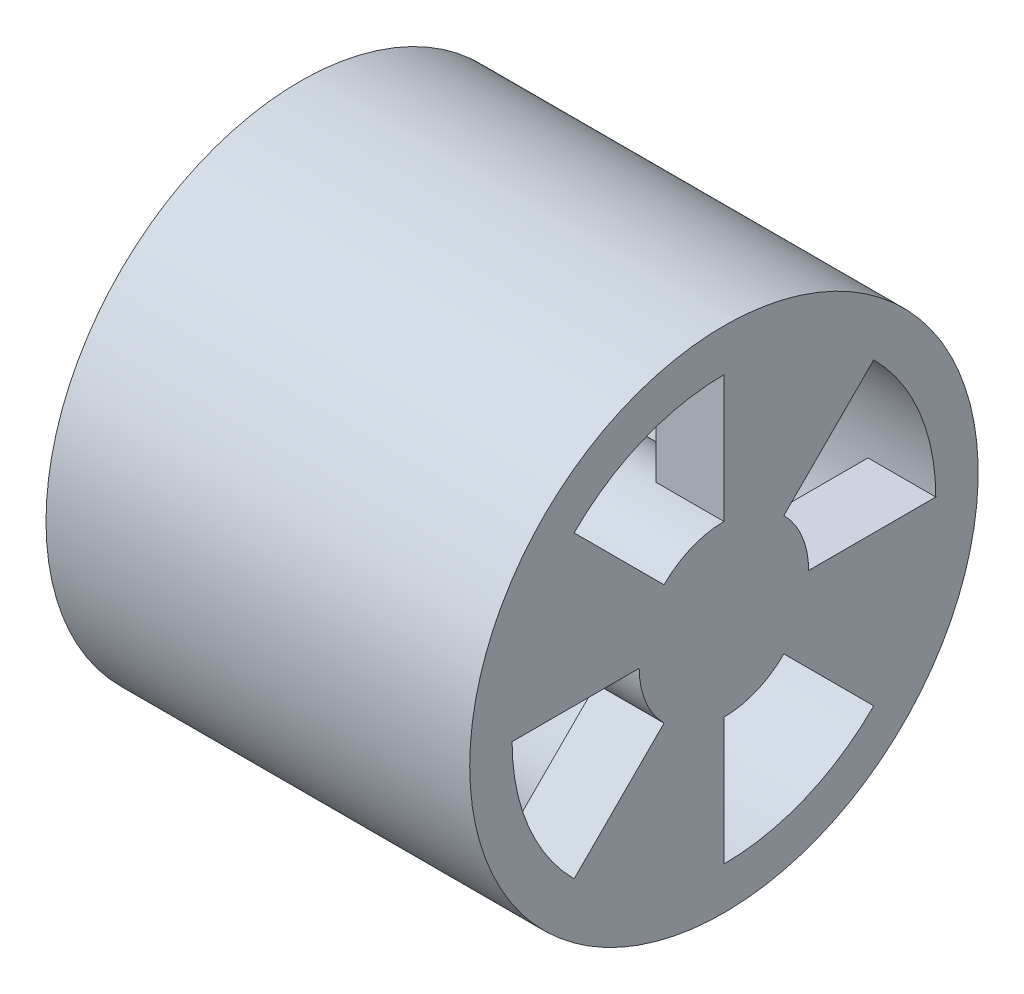
ISO-10303-21;
HEADER;
FILE_DESCRIPTION(('STEP AP214'),'2;1');
FILE_NAME('part.step','',(''),(''),'','','');
FILE_SCHEMA(('AUTOMOTIVE_DESIGN { 1 0 10303 214 1 1 1 1 }'));
ENDSEC;
DATA;
#1=APPLICATION_CONTEXT('core data for automotive mechanical design processes');
#2=APPLICATION_PROTOCOL_DEFINITION('international standard','automotive_design',2000,#1);
#3=PRODUCT_CONTEXT('',#1,'mechanical');
#4=PRODUCT('Part','Part','',(#3));
#5=PRODUCT_RELATED_PRODUCT_CATEGORY('part','',(#4));
#6=PRODUCT_DEFINITION_FORMATION('','',#4);
#7=PRODUCT_DEFINITION_CONTEXT('part definition',#1,'design');
#8=PRODUCT_DEFINITION('design','',#6,#7);
#9=PRODUCT_DEFINITION_SHAPE('','',#8);
#10=(LENGTH_UNIT() NAMED_UNIT(*) SI_UNIT(.MILLI.,.METRE.));
#11=(NAMED_UNIT(*) PLANE_ANGLE_UNIT() SI_UNIT($,.RADIAN.));
#12=(NAMED_UNIT(*) SI_UNIT($,.STERADIAN.) SOLID_ANGLE_UNIT());
#13=UNCERTAINTY_MEASURE_WITH_UNIT(LENGTH_MEASURE(1.E-05),#10,'distance_accuracy_value','');
#14=(GEOMETRIC_REPRESENTATION_CONTEXT(3) GLOBAL_UNCERTAINTY_ASSIGNED_CONTEXT((#13)) GLOBAL_UNIT_ASSIGNED_CONTEXT((#10,
#11,#12)) REPRESENTATION_CONTEXT('',''));
#15=CARTESIAN_POINT('',(0.,0.,0.));
#16=DIRECTION('',(0.,0.,1.));
#17=DIRECTION('',(1.,0.,0.));
#18=AXIS2_PLACEMENT_3D('',#15,#16,#17);
#19=CARTESIAN_POINT('',(21.,0.,0.));
#20=DIRECTION('',(-1.,0.,0.));
#21=DIRECTION('',(0.,0.,1.));
#22=AXIS2_PLACEMENT_3D('',#19,#20,#21);
#23=PLANE('',#22);
#24=DIRECTION('',(0.,0.707106781186552,0.707106781186544));
#25=VECTOR('',#24,1.);
#26=CARTESIAN_POINT('',(21.,0.,0.));
#27=LINE('',#26,#25);
#28=CARTESIAN_POINT('',(21.,3.53553390593276,3.53553390593272));
#29=VERTEX_POINT('',#28);
#30=CARTESIAN_POINT('',(21.,8.83883476483189,8.83883476483179));
#31=VERTEX_POINT('',#30);
#32=EDGE_CURVE('E231',#29,#31,#27,.T.);
#33=ORIENTED_EDGE('',*,*,#32,.F.);
#34=CARTESIAN_POINT('',(21.,0.,0.));
#35=DIRECTION('',(-1.,0.,0.));
#36=DIRECTION('',(0.,0.,1.));
#37=AXIS2_PLACEMENT_3D('',#34,#35,#36);
#38=CIRCLE('',#37,5.);
#39=CARTESIAN_POINT('',(21.,0.,5.));
#40=VERTEX_POINT('',#39);
#41=EDGE_CURVE('E317',#40,#29,#38,.T.);
#42=ORIENTED_EDGE('',*,*,#41,.F.);
#43=DIRECTION('',(0.,0.,1.));
#44=VECTOR('',#43,1.);
#45=CARTESIAN_POINT('',(21.,0.,0.));
#46=LINE('',#45,#44);
#47=CARTESIAN_POINT('',(21.,0.,12.5));
#48=VERTEX_POINT('',#47);
#49=EDGE_CURVE('E256',#40,#48,#46,.T.);
#50=ORIENTED_EDGE('',*,*,#49,.T.);
#51=CARTESIAN_POINT('',(21.,0.,0.));
#52=DIRECTION('',(-1.,0.,0.));
#53=DIRECTION('',(0.,0.,1.));
#54=AXIS2_PLACEMENT_3D('',#51,#52,#53);
#55=CIRCLE('',#54,12.5);
#56=EDGE_CURVE('E327',#48,#31,#55,.T.);
#57=ORIENTED_EDGE('',*,*,#56,.T.);
#58=EDGE_LOOP('',(#33,#42,#50,#57));
#59=FACE_BOUND('',#58,.T.);
#60=ADVANCED_FACE('F39',(#59),#23,.T.);
#61=DIRECTION('',(0.,-1.,0.));
#62=VECTOR('',#61,1.);
#63=CARTESIAN_POINT('',(21.,0.,0.));
#64=LINE('',#63,#62);
#65=CARTESIAN_POINT('',(21.,12.5,0.));
#66=VERTEX_POINT('',#65);
#67=CARTESIAN_POINT('',(21.,5.,0.));
#68=VERTEX_POINT('',#67);
#69=EDGE_CURVE('E218',#66,#68,#64,.T.);
#70=ORIENTED_EDGE('',*,*,#69,.F.);
#71=CARTESIAN_POINT('',(21.,8.83883476483183,-8.83883476483186));
#72=VERTEX_POINT('',#71);
#73=EDGE_CURVE('E332',#66,#72,#55,.T.);
#74=ORIENTED_EDGE('',*,*,#73,.T.);
#75=DIRECTION('',(0.,-0.707106781186546,0.707106781186549));
#76=VECTOR('',#75,1.);
#77=CARTESIAN_POINT('',(21.,0.,0.));
#78=LINE('',#77,#76);
#79=CARTESIAN_POINT('',(21.,3.53553390593273,-3.53553390593275));
#80=VERTEX_POINT('',#79);
#81=EDGE_CURVE('E242',#72,#80,#78,.T.);
#82=ORIENTED_EDGE('',*,*,#81,.T.);
#83=EDGE_CURVE('E322',#68,#80,#38,.T.);
#84=ORIENTED_EDGE('',*,*,#83,.F.);
#85=EDGE_LOOP('',(#70,#74,#82,#84));
#86=FACE_BOUND('',#85,.T.);
#87=ADVANCED_FACE('F382',(#86),#23,.T.);
#88=CARTESIAN_POINT('',(21.,0.,-12.5));
#89=VERTEX_POINT('',#88);
#90=CARTESIAN_POINT('',(21.,-8.83883476483189,-8.83883476483179));
#91=VERTEX_POINT('',#90);
#92=EDGE_CURVE('E461',#89,#91,#55,.T.);
#93=ORIENTED_EDGE('',*,*,#92,.T.);
#94=DIRECTION('',(0.,0.707106781186552,0.707106781186544));
#95=VECTOR('',#94,1.);
#96=CARTESIAN_POINT('',(21.,0.,0.));
#97=LINE('',#96,#95);
#98=CARTESIAN_POINT('',(21.,-3.53553390593276,-3.53553390593272));
#99=VERTEX_POINT('',#98);
#100=EDGE_CURVE('E173',#91,#99,#97,.T.);
#101=ORIENTED_EDGE('',*,*,#100,.T.);
#102=CARTESIAN_POINT('',(21.,0.,-5.));
#103=VERTEX_POINT('',#102);
#104=EDGE_CURVE('E441',#103,#99,#38,.T.);
#105=ORIENTED_EDGE('',*,*,#104,.F.);
#106=DIRECTION('',(0.,0.,1.));
#107=VECTOR('',#106,1.);
#108=CARTESIAN_POINT('',(21.,0.,0.));
#109=LINE('',#108,#107);
#110=EDGE_CURVE('E288',#89,#103,#109,.T.);
#111=ORIENTED_EDGE('',*,*,#110,.F.);
#112=EDGE_LOOP('',(#93,#101,#105,#111));
#113=FACE_BOUND('',#112,.T.);
#114=ADVANCED_FACE('F377',(#113),#23,.T.);
#115=DIRECTION('',(0.,-0.707106781186546,0.707106781186549));
#116=VECTOR('',#115,1.);
#117=CARTESIAN_POINT('',(21.,0.,0.));
#118=LINE('',#117,#116);
#119=CARTESIAN_POINT('',(21.,-3.53553390593273,3.53553390593275));
#120=VERTEX_POINT('',#119);
#121=CARTESIAN_POINT('',(21.,-8.83883476483183,8.83883476483186));
#122=VERTEX_POINT('',#121);
#123=EDGE_CURVE('E207',#120,#122,#118,.T.);
#124=ORIENTED_EDGE('',*,*,#123,.F.);
#125=CARTESIAN_POINT('',(21.,-5.,0.));
#126=VERTEX_POINT('',#125);
#127=EDGE_CURVE('E323',#126,#120,#38,.T.);
#128=ORIENTED_EDGE('',*,*,#127,.F.);
#129=DIRECTION('',(0.,-1.,0.));
#130=VECTOR('',#129,1.);
#131=CARTESIAN_POINT('',(21.,0.,0.));
#132=LINE('',#131,#130);
#133=CARTESIAN_POINT('',(21.,-12.5,0.));
#134=VERTEX_POINT('',#133);
#135=EDGE_CURVE('E193',#126,#134,#132,.T.);
#136=ORIENTED_EDGE('',*,*,#135,.T.);
#137=EDGE_CURVE('E321',#134,#122,#55,.T.);
#138=ORIENTED_EDGE('',*,*,#137,.T.);
#139=EDGE_LOOP('',(#124,#128,#136,#138));
#140=FACE_BOUND('',#139,.T.);
#141=ADVANCED_FACE('F369',(#140),#23,.T.);
#142=CARTESIAN_POINT('',(25.,15.,0.));
#143=DIRECTION('',(-1.,0.,0.));
#144=DIRECTION('',(0.,0.,1.));
#145=AXIS2_PLACEMENT_3D('',#142,#143,#144);
#146=PLANE('',#145);
#147=DIRECTION('',(0.,-1.,0.));
#148=VECTOR('',#147,1.);
#149=CARTESIAN_POINT('',(25.,0.,0.));
#150=LINE('',#149,#148);
#151=CARTESIAN_POINT('',(25.,12.5,0.));
#152=VERTEX_POINT('',#151);
#153=CARTESIAN_POINT('',(25.,5.,0.));
#154=VERTEX_POINT('',#153);
#155=EDGE_CURVE('E226',#152,#154,#150,.T.);
#156=ORIENTED_EDGE('',*,*,#155,.T.);
#157=CARTESIAN_POINT('',(25.,0.,0.));
#158=DIRECTION('',(-1.,0.,0.));
#159=DIRECTION('',(0.,0.,1.));
#160=AXIS2_PLACEMENT_3D('',#157,#158,#159);
#161=CIRCLE('',#160,5.);
#162=CARTESIAN_POINT('',(25.,3.53553390593276,3.53553390593272));
#163=VERTEX_POINT('',#162);
#164=EDGE_CURVE('E213',#154,#163,#161,.F.);
#165=ORIENTED_EDGE('',*,*,#164,.T.);
#166=DIRECTION('',(0.,0.707106781186552,0.707106781186544));
#167=VECTOR('',#166,1.);
#168=CARTESIAN_POINT('',(25.,0.,0.));
#169=LINE('',#168,#167);
#170=CARTESIAN_POINT('',(25.,8.83883476483189,8.83883476483179));
#171=VERTEX_POINT('',#170);
#172=EDGE_CURVE('E217',#163,#171,#169,.T.);
#173=ORIENTED_EDGE('',*,*,#172,.T.);
#174=CARTESIAN_POINT('',(25.,0.,0.));
#175=DIRECTION('',(-1.,0.,0.));
#176=DIRECTION('',(0.,0.,1.));
#177=AXIS2_PLACEMENT_3D('',#174,#175,#176);
#178=CIRCLE('',#177,12.5);
#179=EDGE_CURVE('E222',#171,#152,#178,.T.);
#180=ORIENTED_EDGE('',*,*,#179,.T.);
#181=EDGE_LOOP('',(#156,#165,#173,#180));
#182=FACE_BOUND('',#181,.T.);
#183=DIRECTION('',(0.,0.,1.));
#184=VECTOR('',#183,1.);
#185=CARTESIAN_POINT('',(25.,0.,0.));
#186=LINE('',#185,#184);
#187=CARTESIAN_POINT('',(25.,0.,5.));
#188=VERTEX_POINT('',#187);
#189=CARTESIAN_POINT('',(25.,0.,12.5));
#190=VERTEX_POINT('',#189);
#191=EDGE_CURVE('E264',#188,#190,#186,.T.);
#192=ORIENTED_EDGE('',*,*,#191,.F.);
#193=CARTESIAN_POINT('',(25.,0.,0.));
#194=DIRECTION('',(-1.,0.,0.));
#195=DIRECTION('',(0.,0.,1.));
#196=AXIS2_PLACEMENT_3D('',#193,#194,#195);
#197=CIRCLE('',#196,5.);
#198=CARTESIAN_POINT('',(25.,-3.53553390593273,3.53553390593275));
#199=VERTEX_POINT('',#198);
#200=EDGE_CURVE('E251',#188,#199,#197,.F.);
#201=ORIENTED_EDGE('',*,*,#200,.T.);
#202=DIRECTION('',(0.,-0.707106781186546,0.707106781186549));
#203=VECTOR('',#202,1.);
#204=CARTESIAN_POINT('',(25.,0.,0.));
#205=LINE('',#204,#203);
#206=CARTESIAN_POINT('',(25.,-8.83883476483182,8.83883476483186));
#207=VERTEX_POINT('',#206);
#208=EDGE_CURVE('E255',#199,#207,#205,.T.);
#209=ORIENTED_EDGE('',*,*,#208,.T.);
#210=CARTESIAN_POINT('',(25.,0.,0.));
#211=DIRECTION('',(-1.,0.,0.));
#212=DIRECTION('',(0.,0.,1.));
#213=AXIS2_PLACEMENT_3D('',#210,#211,#212);
#214=CIRCLE('',#213,12.5);
#215=EDGE_CURVE('E260',#207,#190,#214,.T.);
#216=ORIENTED_EDGE('',*,*,#215,.T.);
#217=EDGE_LOOP('',(#192,#201,#209,#216));
#218=FACE_BOUND('',#217,.T.);
#219=DIRECTION('',(0.,-0.707106781186546,0.707106781186549));
#220=VECTOR('',#219,1.);
#221=CARTESIAN_POINT('',(25.,0.,0.));
#222=LINE('',#221,#220);
#223=CARTESIAN_POINT('',(25.,8.83883476483183,-8.83883476483186));
#224=VERTEX_POINT('',#223);
#225=CARTESIAN_POINT('',(25.,3.53553390593273,-3.53553390593275));
#226=VERTEX_POINT('',#225);
#227=EDGE_CURVE('E284',#224,#226,#222,.T.);
#228=ORIENTED_EDGE('',*,*,#227,.F.);
#229=CARTESIAN_POINT('',(25.,0.,0.));
#230=DIRECTION('',(-1.,0.,0.));
#231=DIRECTION('',(0.,0.,1.));
#232=AXIS2_PLACEMENT_3D('',#229,#230,#231);
#233=CIRCLE('',#232,12.5);
#234=CARTESIAN_POINT('',(25.,0.,-12.5));
#235=VERTEX_POINT('',#234);
#236=EDGE_CURVE('E287',#224,#235,#233,.T.);
#237=ORIENTED_EDGE('',*,*,#236,.T.);
#238=DIRECTION('',(0.,0.,1.));
#239=VECTOR('',#238,1.);
#240=CARTESIAN_POINT('',(25.,0.,0.));
#241=LINE('',#240,#239);
#242=CARTESIAN_POINT('',(25.,0.,-5.));
#243=VERTEX_POINT('',#242);
#244=EDGE_CURVE('E292',#235,#243,#241,.T.);
#245=ORIENTED_EDGE('',*,*,#244,.T.);
#246=CARTESIAN_POINT('',(25.,0.,0.));
#247=DIRECTION('',(-1.,0.,0.));
#248=DIRECTION('',(0.,0.,1.));
#249=AXIS2_PLACEMENT_3D('',#246,#247,#248);
#250=CIRCLE('',#249,5.);
#251=EDGE_CURVE('E296',#243,#226,#250,.F.);
#252=ORIENTED_EDGE('',*,*,#251,.T.);
#253=EDGE_LOOP('',(#228,#237,#245,#252));
#254=FACE_BOUND('',#253,.T.);
#255=CARTESIAN_POINT('',(25.,0.,0.));
#256=DIRECTION('',(-1.,0.,0.));
#257=DIRECTION('',(0.,0.,1.));
#258=AXIS2_PLACEMENT_3D('',#255,#256,#257);
#259=CIRCLE('',#258,15.);
#260=CARTESIAN_POINT('',(25.,0.,15.));
#261=VERTEX_POINT('',#260);
#262=EDGE_CURVE('E11',#261,#261,#259,.T.);
#263=ORIENTED_EDGE('',*,*,#262,.F.);
#264=EDGE_LOOP('',(#263));
#265=FACE_BOUND('',#264,.T.);
#266=DIRECTION('',(0.,0.707106781186552,0.707106781186544));
#267=VECTOR('',#266,1.);
#268=CARTESIAN_POINT('',(25.,0.,0.));
#269=LINE('',#268,#267);
#270=CARTESIAN_POINT('',(25.,-8.83883476483189,-8.83883476483179));
#271=VERTEX_POINT('',#270);
#272=CARTESIAN_POINT('',(25.,-3.53553390593276,-3.53553390593272));
#273=VERTEX_POINT('',#272);
#274=EDGE_CURVE('E170',#271,#273,#269,.T.);
#275=ORIENTED_EDGE('',*,*,#274,.F.);
#276=CARTESIAN_POINT('',(25.,0.,0.));
#277=DIRECTION('',(-1.,0.,0.));
#278=DIRECTION('',(0.,0.,1.));
#279=AXIS2_PLACEMENT_3D('',#276,#277,#278);
#280=CIRCLE('',#279,12.5);
#281=CARTESIAN_POINT('',(25.,-12.5,0.));
#282=VERTEX_POINT('',#281);
#283=EDGE_CURVE('E181',#271,#282,#280,.T.);
#284=ORIENTED_EDGE('',*,*,#283,.T.);
#285=DIRECTION('',(0.,-1.,0.));
#286=VECTOR('',#285,1.);
#287=CARTESIAN_POINT('',(25.,0.,0.));
#288=LINE('',#287,#286);
#289=CARTESIAN_POINT('',(25.,-5.,0.));
#290=VERTEX_POINT('',#289);
#291=EDGE_CURVE('E188',#290,#282,#288,.T.);
#292=ORIENTED_EDGE('',*,*,#291,.F.);
#293=CARTESIAN_POINT('',(25.,0.,0.));
#294=DIRECTION('',(-1.,0.,0.));
#295=DIRECTION('',(0.,0.,1.));
#296=AXIS2_PLACEMENT_3D('',#293,#294,#295);
#297=CIRCLE('',#296,5.);
#298=EDGE_CURVE('E178',#290,#273,#297,.F.);
#299=ORIENTED_EDGE('',*,*,#298,.T.);
#300=EDGE_LOOP('',(#275,#284,#292,#299));
#301=FACE_BOUND('',#300,.T.);
#302=ADVANCED_FACE('F41',(#182,#218,#254,#265,#301),#146,.F.);
#303=CARTESIAN_POINT('',(0.,0.,0.));
#304=DIRECTION('',(-1.,0.,0.));
#305=DIRECTION('',(0.,0.,1.));
#306=AXIS2_PLACEMENT_3D('',#303,#304,#305);
#307=CYLINDRICAL_SURFACE('',#306,12.5);
#308=CARTESIAN_POINT('',(0.,0.,0.));
#309=DIRECTION('',(-1.,0.,0.));
#310=DIRECTION('',(0.,0.,1.));
#311=AXIS2_PLACEMENT_3D('',#308,#309,#310);
#312=CIRCLE('',#311,12.5);
#313=CARTESIAN_POINT('',(0.,0.,12.5));
#314=VERTEX_POINT('',#313);
#315=EDGE_CURVE('E351',#314,#314,#312,.T.);
#316=ORIENTED_EDGE('',*,*,#315,.T.);
#317=EDGE_LOOP('',(#316));
#318=FACE_BOUND('',#317,.T.);
#319=ORIENTED_EDGE('',*,*,#56,.F.);
#320=DIRECTION('',(-1.,0.,0.));
#321=VECTOR('',#320,1.);
#322=CARTESIAN_POINT('',(25.,0.,12.5));
#323=LINE('',#322,#321);
#324=EDGE_CURVE('E276',#190,#48,#323,.T.);
#325=ORIENTED_EDGE('',*,*,#324,.F.);
#326=ORIENTED_EDGE('',*,*,#215,.F.);
#327=DIRECTION('',(-1.,0.,0.));
#328=VECTOR('',#327,1.);
#329=CARTESIAN_POINT('',(25.,-8.83883476483183,8.83883476483186));
#330=LINE('',#329,#328);
#331=EDGE_CURVE('E279',#207,#122,#330,.T.);
#332=ORIENTED_EDGE('',*,*,#331,.T.);
#333=ORIENTED_EDGE('',*,*,#137,.F.);
#334=DIRECTION('',(-1.,0.,0.));
#335=VECTOR('',#334,1.);
#336=CARTESIAN_POINT('',(25.,-12.5,0.));
#337=LINE('',#336,#335);
#338=EDGE_CURVE('E55',#282,#134,#337,.T.);
#339=ORIENTED_EDGE('',*,*,#338,.F.);
#340=ORIENTED_EDGE('',*,*,#283,.F.);
#341=DIRECTION('',(-1.,0.,0.));
#342=VECTOR('',#341,1.);
#343=CARTESIAN_POINT('',(25.,-8.83883476483189,-8.83883476483179));
#344=LINE('',#343,#342);
#345=EDGE_CURVE('E166',#271,#91,#344,.T.);
#346=ORIENTED_EDGE('',*,*,#345,.T.);
#347=ORIENTED_EDGE('',*,*,#92,.F.);
#348=DIRECTION('',(-1.,0.,0.));
#349=VECTOR('',#348,1.);
#350=CARTESIAN_POINT('',(25.,0.,-12.5));
#351=LINE('',#350,#349);
#352=EDGE_CURVE('E63',#235,#89,#351,.T.);
#353=ORIENTED_EDGE('',*,*,#352,.F.);
#354=ORIENTED_EDGE('',*,*,#236,.F.);
#355=DIRECTION('',(-1.,0.,0.));
#356=VECTOR('',#355,1.);
#357=CARTESIAN_POINT('',(25.,8.83883476483183,-8.83883476483186));
#358=LINE('',#357,#356);
#359=EDGE_CURVE('E300',#224,#72,#358,.T.);
#360=ORIENTED_EDGE('',*,*,#359,.T.);
#361=ORIENTED_EDGE('',*,*,#73,.F.);
#362=DIRECTION('',(-1.,0.,0.));
#363=VECTOR('',#362,1.);
#364=CARTESIAN_POINT('',(25.,12.5,0.));
#365=LINE('',#364,#363);
#366=EDGE_CURVE('E243',#152,#66,#365,.T.);
#367=ORIENTED_EDGE('',*,*,#366,.F.);
#368=ORIENTED_EDGE('',*,*,#179,.F.);
#369=DIRECTION('',(-1.,0.,0.));
#370=VECTOR('',#369,1.);
#371=CARTESIAN_POINT('',(25.,8.83883476483189,8.83883476483179));
#372=LINE('',#371,#370);
#373=EDGE_CURVE('E246',#171,#31,#372,.T.);
#374=ORIENTED_EDGE('',*,*,#373,.T.);
#375=EDGE_LOOP('',(#319,#325,#326,#332,#333,#339,#340,#346,#347,#353,#354,#360,#361,#367,#368,#374));
#376=FACE_BOUND('',#375,.T.);
#377=ADVANCED_FACE('F183',(#318,#376),#307,.F.);
#378=CARTESIAN_POINT('',(0.,0.,0.));
#379=DIRECTION('',(-1.,0.,0.));
#380=DIRECTION('',(0.,0.,1.));
#381=AXIS2_PLACEMENT_3D('',#378,#379,#380);
#382=CYLINDRICAL_SURFACE('',#381,15.);
#383=CARTESIAN_POINT('',(0.,0.,0.));
#384=DIRECTION('',(-1.,0.,0.));
#385=DIRECTION('',(0.,0.,1.));
#386=AXIS2_PLACEMENT_3D('',#383,#384,#385);
#387=CIRCLE('',#386,15.);
#388=CARTESIAN_POINT('',(0.,0.,15.));
#389=VERTEX_POINT('',#388);
#390=EDGE_CURVE('E48',#389,#389,#387,.T.);
#391=ORIENTED_EDGE('',*,*,#390,.F.);
#392=EDGE_LOOP('',(#391));
#393=FACE_BOUND('',#392,.T.);
#394=ORIENTED_EDGE('',*,*,#262,.T.);
#395=EDGE_LOOP('',(#394));
#396=FACE_BOUND('',#395,.T.);
#397=ADVANCED_FACE('F363',(#393,#396),#382,.T.);
#398=CARTESIAN_POINT('',(0.,15.,0.));
#399=DIRECTION('',(1.,0.,0.));
#400=DIRECTION('',(0.,0.,-1.));
#401=AXIS2_PLACEMENT_3D('',#398,#399,#400);
#402=PLANE('',#401);
#403=ORIENTED_EDGE('',*,*,#315,.F.);
#404=EDGE_LOOP('',(#403));
#405=FACE_BOUND('',#404,.T.);
#406=ORIENTED_EDGE('',*,*,#390,.T.);
#407=EDGE_LOOP('',(#406));
#408=FACE_BOUND('',#407,.T.);
#409=ADVANCED_FACE('F361',(#405,#408),#402,.F.);
#410=CARTESIAN_POINT('',(21.,0.,0.));
#411=DIRECTION('',(-1.,0.,0.));
#412=DIRECTION('',(0.,0.,1.));
#413=AXIS2_PLACEMENT_3D('',#410,#411,#412);
#414=CYLINDRICAL_SURFACE('',#413,5.);
#415=ORIENTED_EDGE('',*,*,#41,.T.);
#416=DIRECTION('',(-1.,0.,0.));
#417=VECTOR('',#416,1.);
#418=CARTESIAN_POINT('',(25.,3.53553390593276,3.53553390593272));
#419=LINE('',#418,#417);
#420=EDGE_CURVE('E230',#163,#29,#419,.T.);
#421=ORIENTED_EDGE('',*,*,#420,.F.);
#422=ORIENTED_EDGE('',*,*,#164,.F.);
#423=DIRECTION('',(-1.,0.,0.));
#424=VECTOR('',#423,1.);
#425=CARTESIAN_POINT('',(25.,5.,0.));
#426=LINE('',#425,#424);
#427=EDGE_CURVE('E239',#154,#68,#426,.T.);
#428=ORIENTED_EDGE('',*,*,#427,.T.);
#429=ORIENTED_EDGE('',*,*,#83,.T.);
#430=DIRECTION('',(-1.,0.,0.));
#431=VECTOR('',#430,1.);
#432=CARTESIAN_POINT('',(25.,3.53553390593273,-3.53553390593275));
#433=LINE('',#432,#431);
#434=EDGE_CURVE('E306',#226,#80,#433,.T.);
#435=ORIENTED_EDGE('',*,*,#434,.F.);
#436=ORIENTED_EDGE('',*,*,#251,.F.);
#437=DIRECTION('',(-1.,0.,0.));
#438=VECTOR('',#437,1.);
#439=CARTESIAN_POINT('',(25.,0.,-5.));
#440=LINE('',#439,#438);
#441=EDGE_CURVE('E310',#243,#103,#440,.T.);
#442=ORIENTED_EDGE('',*,*,#441,.T.);
#443=ORIENTED_EDGE('',*,*,#104,.T.);
#444=DIRECTION('',(-1.,0.,0.));
#445=VECTOR('',#444,1.);
#446=CARTESIAN_POINT('',(25.,-3.53553390593276,-3.53553390593272));
#447=LINE('',#446,#445);
#448=EDGE_CURVE('E204',#273,#99,#447,.T.);
#449=ORIENTED_EDGE('',*,*,#448,.F.);
#450=ORIENTED_EDGE('',*,*,#298,.F.);
#451=DIRECTION('',(-1.,0.,0.));
#452=VECTOR('',#451,1.);
#453=CARTESIAN_POINT('',(25.,-5.,0.));
#454=LINE('',#453,#452);
#455=EDGE_CURVE('E208',#290,#126,#454,.T.);
#456=ORIENTED_EDGE('',*,*,#455,.T.);
#457=ORIENTED_EDGE('',*,*,#127,.T.);
#458=DIRECTION('',(-1.,0.,0.));
#459=VECTOR('',#458,1.);
#460=CARTESIAN_POINT('',(25.,-3.53553390593273,3.53553390593275));
#461=LINE('',#460,#459);
#462=EDGE_CURVE('E267',#199,#120,#461,.T.);
#463=ORIENTED_EDGE('',*,*,#462,.F.);
#464=ORIENTED_EDGE('',*,*,#200,.F.);
#465=DIRECTION('',(-1.,0.,0.));
#466=VECTOR('',#465,1.);
#467=CARTESIAN_POINT('',(25.,0.,5.));
#468=LINE('',#467,#466);
#469=EDGE_CURVE('E235',#188,#40,#468,.T.);
#470=ORIENTED_EDGE('',*,*,#469,.T.);
#471=EDGE_LOOP('',(#415,#421,#422,#428,#429,#435,#436,#442,#443,#449,#450,#456,#457,#463,#464,#470));
#472=FACE_BOUND('',#471,.T.);
#473=CARTESIAN_POINT('',(8.,0.,0.));
#474=DIRECTION('',(-1.,0.,0.));
#475=DIRECTION('',(0.,0.,1.));
#476=AXIS2_PLACEMENT_3D('',#473,#474,#475);
#477=CIRCLE('',#476,5.);
#478=CARTESIAN_POINT('',(8.,0.,5.));
#479=VERTEX_POINT('',#478);
#480=EDGE_CURVE('E309',#479,#479,#477,.T.);
#481=ORIENTED_EDGE('',*,*,#480,.F.);
#482=EDGE_LOOP('',(#481));
#483=FACE_BOUND('',#482,.T.);
#484=ADVANCED_FACE('F391',(#472,#483),#414,.T.);
#485=CARTESIAN_POINT('',(18.,0.,0.));
#486=DIRECTION('',(-1.,0.,0.));
#487=DIRECTION('',(0.,0.,1.));
#488=AXIS2_PLACEMENT_3D('',#485,#486,#487);
#489=PLANE('',#488);
#490=CARTESIAN_POINT('',(18.,0.,0.));
#491=DIRECTION('',(-1.,0.,0.));
#492=DIRECTION('',(0.,0.,1.));
#493=AXIS2_PLACEMENT_3D('',#490,#491,#492);
#494=CIRCLE('',#493,1.5);
#495=CARTESIAN_POINT('',(18.,1.25,0.82915619758885));
#496=VERTEX_POINT('',#495);
#497=CARTESIAN_POINT('',(18.,-1.25,0.82915619758885));
#498=VERTEX_POINT('',#497);
#499=EDGE_CURVE('E333',#496,#498,#494,.T.);
#500=ORIENTED_EDGE('',*,*,#499,.T.);
#501=DIRECTION('',(0.,1.,0.));
#502=VECTOR('',#501,1.);
#503=CARTESIAN_POINT('',(18.,1.25,0.82915619758885));
#504=LINE('',#503,#502);
#505=EDGE_CURVE('E337',#498,#496,#504,.T.);
#506=ORIENTED_EDGE('',*,*,#505,.T.);
#507=EDGE_LOOP('',(#500,#506));
#508=FACE_BOUND('',#507,.T.);
#509=ADVANCED_FACE('F393',(#508),#489,.T.);
#510=CARTESIAN_POINT('',(18.,0.,0.));
#511=DIRECTION('',(-1.,0.,0.));
#512=DIRECTION('',(0.,0.,1.));
#513=AXIS2_PLACEMENT_3D('',#510,#511,#512);
#514=CYLINDRICAL_SURFACE('',#513,1.5);
#515=CARTESIAN_POINT('',(8.,0.,0.));
#516=DIRECTION('',(-1.,0.,0.));
#517=DIRECTION('',(0.,0.,1.));
#518=AXIS2_PLACEMENT_3D('',#515,#516,#517);
#519=CIRCLE('',#518,1.5);
#520=CARTESIAN_POINT('',(8.,1.25,0.82915619758885));
#521=VERTEX_POINT('',#520);
#522=CARTESIAN_POINT('',(8.,-1.25,0.82915619758885));
#523=VERTEX_POINT('',#522);
#524=EDGE_CURVE('E331',#521,#523,#519,.T.);
#525=ORIENTED_EDGE('',*,*,#524,.T.);
#526=DIRECTION('',(-1.,0.,0.));
#527=VECTOR('',#526,1.);
#528=CARTESIAN_POINT('',(18.,-1.25,0.82915619758885));
#529=LINE('',#528,#527);
#530=EDGE_CURVE('E342',#498,#523,#529,.T.);
#531=ORIENTED_EDGE('',*,*,#530,.F.);
#532=ORIENTED_EDGE('',*,*,#499,.F.);
#533=DIRECTION('',(-1.,0.,0.));
#534=VECTOR('',#533,1.);
#535=CARTESIAN_POINT('',(18.,1.25,0.82915619758885));
#536=LINE('',#535,#534);
#537=EDGE_CURVE('E348',#496,#521,#536,.T.);
#538=ORIENTED_EDGE('',*,*,#537,.T.);
#539=EDGE_LOOP('',(#525,#531,#532,#538));
#540=FACE_BOUND('',#539,.T.);
#541=ADVANCED_FACE('F396',(#540),#514,.F.);
#542=CARTESIAN_POINT('',(18.,1.25,0.82915619758885));
#543=DIRECTION('',(0.,0.,1.));
#544=DIRECTION('',(1.,0.,0.));
#545=AXIS2_PLACEMENT_3D('',#542,#543,#544);
#546=PLANE('',#545);
#547=DIRECTION('',(0.,1.,0.));
#548=VECTOR('',#547,1.);
#549=CARTESIAN_POINT('',(8.,1.25,0.82915619758885));
#550=LINE('',#549,#548);
#551=EDGE_CURVE('E338',#523,#521,#550,.T.);
#552=ORIENTED_EDGE('',*,*,#551,.T.);
#553=ORIENTED_EDGE('',*,*,#537,.F.);
#554=ORIENTED_EDGE('',*,*,#505,.F.);
#555=ORIENTED_EDGE('',*,*,#530,.T.);
#556=EDGE_LOOP('',(#552,#553,#554,#555));
#557=FACE_BOUND('',#556,.T.);
#558=ADVANCED_FACE('F398',(#557),#546,.F.);
#559=CARTESIAN_POINT('',(8.,0.,0.));
#560=DIRECTION('',(1.,0.,0.));
#561=DIRECTION('',(0.,0.,-1.));
#562=AXIS2_PLACEMENT_3D('',#559,#560,#561);
#563=PLANE('',#562);
#564=ORIENTED_EDGE('',*,*,#551,.F.);
#565=ORIENTED_EDGE('',*,*,#524,.F.);
#566=EDGE_LOOP('',(#564,#565));
#567=FACE_BOUND('',#566,.T.);
#568=ORIENTED_EDGE('',*,*,#480,.T.);
#569=EDGE_LOOP('',(#568));
#570=FACE_BOUND('',#569,.T.);
#571=ADVANCED_FACE('F401',(#567,#570),#563,.F.);
#572=CARTESIAN_POINT('',(25.,0.,0.));
#573=DIRECTION('',(0.,-0.707106781186549,-0.707106781186546));
#574=DIRECTION('',(0.,0.707106781186546,-0.707106781186549));
#575=AXIS2_PLACEMENT_3D('',#572,#573,#574);
#576=PLANE('',#575);
#577=ORIENTED_EDGE('',*,*,#81,.F.);
#578=ORIENTED_EDGE('',*,*,#359,.F.);
#579=ORIENTED_EDGE('',*,*,#227,.T.);
#580=ORIENTED_EDGE('',*,*,#434,.T.);
#581=EDGE_LOOP('',(#577,#578,#579,#580));
#582=FACE_BOUND('',#581,.T.);
#583=ADVANCED_FACE('F407',(#582),#576,.T.);
#584=CARTESIAN_POINT('',(25.,0.,0.));
#585=DIRECTION('',(0.,-1.,0.));
#586=DIRECTION('',(0.,0.,-1.));
#587=AXIS2_PLACEMENT_3D('',#584,#585,#586);
#588=PLANE('',#587);
#589=ORIENTED_EDGE('',*,*,#110,.T.);
#590=ORIENTED_EDGE('',*,*,#441,.F.);
#591=ORIENTED_EDGE('',*,*,#244,.F.);
#592=ORIENTED_EDGE('',*,*,#352,.T.);
#593=EDGE_LOOP('',(#589,#590,#591,#592));
#594=FACE_BOUND('',#593,.T.);
#595=ADVANCED_FACE('F468',(#594),#588,.F.);
#596=CARTESIAN_POINT('',(25.,0.,0.));
#597=DIRECTION('',(0.,-0.707106781186544,0.707106781186552));
#598=DIRECTION('',(0.,-0.707106781186552,-0.707106781186544));
#599=AXIS2_PLACEMENT_3D('',#596,#597,#598);
#600=PLANE('',#599);
#601=ORIENTED_EDGE('',*,*,#100,.F.);
#602=ORIENTED_EDGE('',*,*,#345,.F.);
#603=ORIENTED_EDGE('',*,*,#274,.T.);
#604=ORIENTED_EDGE('',*,*,#448,.T.);
#605=EDGE_LOOP('',(#601,#602,#603,#604));
#606=FACE_BOUND('',#605,.T.);
#607=ADVANCED_FACE('F168',(#606),#600,.T.);
#608=CARTESIAN_POINT('',(25.,0.,0.));
#609=DIRECTION('',(0.,0.,-1.));
#610=DIRECTION('',(-1.,0.,0.));
#611=AXIS2_PLACEMENT_3D('',#608,#609,#610);
#612=PLANE('',#611);
#613=ORIENTED_EDGE('',*,*,#135,.F.);
#614=ORIENTED_EDGE('',*,*,#455,.F.);
#615=ORIENTED_EDGE('',*,*,#291,.T.);
#616=ORIENTED_EDGE('',*,*,#338,.T.);
#617=EDGE_LOOP('',(#613,#614,#615,#616));
#618=FACE_BOUND('',#617,.T.);
#619=ADVANCED_FACE('F475',(#618),#612,.T.);
#620=CARTESIAN_POINT('',(25.,0.,0.));
#621=DIRECTION('',(0.,-1.,0.));
#622=DIRECTION('',(0.,0.,-1.));
#623=AXIS2_PLACEMENT_3D('',#620,#621,#622);
#624=PLANE('',#623);
#625=ORIENTED_EDGE('',*,*,#49,.F.);
#626=ORIENTED_EDGE('',*,*,#469,.F.);
#627=ORIENTED_EDGE('',*,*,#191,.T.);
#628=ORIENTED_EDGE('',*,*,#324,.T.);
#629=EDGE_LOOP('',(#625,#626,#627,#628));
#630=FACE_BOUND('',#629,.T.);
#631=ADVANCED_FACE('F458',(#630),#624,.T.);
#632=CARTESIAN_POINT('',(25.,0.,0.));
#633=DIRECTION('',(0.,-0.707106781186549,-0.707106781186546));
#634=DIRECTION('',(0.,0.707106781186546,-0.707106781186549));
#635=AXIS2_PLACEMENT_3D('',#632,#633,#634);
#636=PLANE('',#635);
#637=ORIENTED_EDGE('',*,*,#123,.T.);
#638=ORIENTED_EDGE('',*,*,#331,.F.);
#639=ORIENTED_EDGE('',*,*,#208,.F.);
#640=ORIENTED_EDGE('',*,*,#462,.T.);
#641=EDGE_LOOP('',(#637,#638,#639,#640));
#642=FACE_BOUND('',#641,.T.);
#643=ADVANCED_FACE('F453',(#642),#636,.F.);
#644=CARTESIAN_POINT('',(25.,0.,0.));
#645=DIRECTION('',(0.,0.,-1.));
#646=DIRECTION('',(-1.,0.,0.));
#647=AXIS2_PLACEMENT_3D('',#644,#645,#646);
#648=PLANE('',#647);
#649=ORIENTED_EDGE('',*,*,#69,.T.);
#650=ORIENTED_EDGE('',*,*,#427,.F.);
#651=ORIENTED_EDGE('',*,*,#155,.F.);
#652=ORIENTED_EDGE('',*,*,#366,.T.);
#653=EDGE_LOOP('',(#649,#650,#651,#652));
#654=FACE_BOUND('',#653,.T.);
#655=ADVANCED_FACE('F436',(#654),#648,.F.);
#656=CARTESIAN_POINT('',(25.,0.,0.));
#657=DIRECTION('',(0.,-0.707106781186544,0.707106781186552));
#658=DIRECTION('',(0.,-0.707106781186552,-0.707106781186544));
#659=AXIS2_PLACEMENT_3D('',#656,#657,#658);
#660=PLANE('',#659);
#661=ORIENTED_EDGE('',*,*,#32,.T.);
#662=ORIENTED_EDGE('',*,*,#373,.F.);
#663=ORIENTED_EDGE('',*,*,#172,.F.);
#664=ORIENTED_EDGE('',*,*,#420,.T.);
#665=EDGE_LOOP('',(#661,#662,#663,#664));
#666=FACE_BOUND('',#665,.T.);
#667=ADVANCED_FACE('F429',(#666),#660,.F.);
#668=CLOSED_SHELL('',(#60,#87,#114,#141,#302,#377,#397,#409,#484,#509,#541,#558,#571,#583,#595,
#607,#619,#631,#643,#655,#667));
#669=MANIFOLD_SOLID_BREP('B2',#668);
#670=ADVANCED_BREP_SHAPE_REPRESENTATION('',(#18,#669),#14);
#671=SHAPE_DEFINITION_REPRESENTATION(#9,#670);
ENDSEC;
END-ISO-10303-21;
